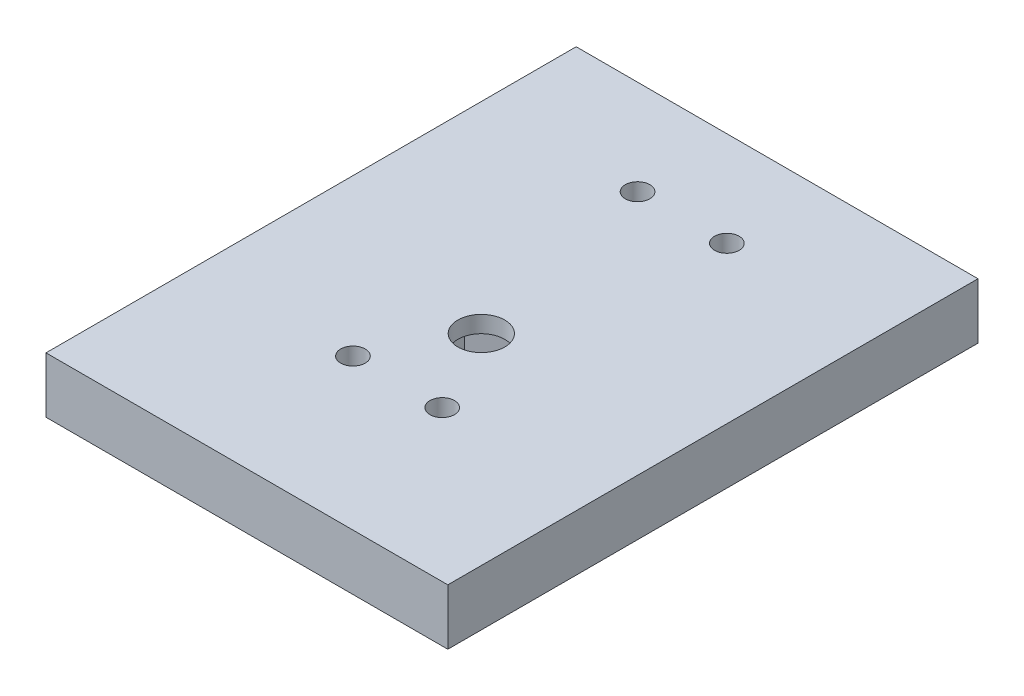
ISO-10303-21;
HEADER;
FILE_DESCRIPTION(('STEP AP214'),'2;1');
FILE_NAME('part.step','',(''),(''),'','','');
FILE_SCHEMA(('AUTOMOTIVE_DESIGN { 1 0 10303 214 1 1 1 1 }'));
ENDSEC;
DATA;
#1=APPLICATION_CONTEXT('core data for automotive mechanical design processes');
#2=APPLICATION_PROTOCOL_DEFINITION('international standard','automotive_design',2000,#1);
#3=PRODUCT_CONTEXT('',#1,'mechanical');
#4=PRODUCT('Part','Part','',(#3));
#5=PRODUCT_RELATED_PRODUCT_CATEGORY('part','',(#4));
#6=PRODUCT_DEFINITION_FORMATION('','',#4);
#7=PRODUCT_DEFINITION_CONTEXT('part definition',#1,'design');
#8=PRODUCT_DEFINITION('design','',#6,#7);
#9=PRODUCT_DEFINITION_SHAPE('','',#8);
#10=(LENGTH_UNIT() NAMED_UNIT(*) SI_UNIT(.MILLI.,.METRE.));
#11=(NAMED_UNIT(*) PLANE_ANGLE_UNIT() SI_UNIT($,.RADIAN.));
#12=(NAMED_UNIT(*) SI_UNIT($,.STERADIAN.) SOLID_ANGLE_UNIT());
#13=UNCERTAINTY_MEASURE_WITH_UNIT(LENGTH_MEASURE(1.E-05),#10,'distance_accuracy_value','');
#14=(GEOMETRIC_REPRESENTATION_CONTEXT(3) GLOBAL_UNCERTAINTY_ASSIGNED_CONTEXT((#13)) GLOBAL_UNIT_ASSIGNED_CONTEXT((#10,
#11,#12)) REPRESENTATION_CONTEXT('',''));
#15=CARTESIAN_POINT('',(0.,0.,0.));
#16=DIRECTION('',(0.,0.,1.));
#17=DIRECTION('',(1.,0.,0.));
#18=AXIS2_PLACEMENT_3D('',#15,#16,#17);
#19=CARTESIAN_POINT('',(0.,10.,0.));
#20=DIRECTION('',(0.,-1.,0.));
#21=DIRECTION('',(0.,0.,-1.));
#22=AXIS2_PLACEMENT_3D('',#19,#20,#21);
#23=PLANE('',#22);
#24=CARTESIAN_POINT('',(117.160731424353,10.,25.3275510204083));
#25=DIRECTION('',(0.,-1.,0.));
#26=DIRECTION('',(0.,0.,-1.));
#27=AXIS2_PLACEMENT_3D('',#24,#25,#26);
#28=CIRCLE('',#27,4.19999999999999);
#29=CARTESIAN_POINT('',(117.160731424353,10.,21.1275510204083));
#30=VERTEX_POINT('',#29);
#31=EDGE_CURVE('E37',#30,#30,#28,.T.);
#32=ORIENTED_EDGE('',*,*,#31,.T.);
#33=EDGE_LOOP('',(#32));
#34=FACE_BOUND('',#33,.T.);
#35=DIRECTION('',(0.,0.,-1.));
#36=VECTOR('',#35,1.);
#37=CARTESIAN_POINT('',(153.160731424353,10.,-27.6724489795918));
#38=LINE('',#37,#36);
#39=CARTESIAN_POINT('',(153.160731424353,10.,67.3275510204082));
#40=VERTEX_POINT('',#39);
#41=CARTESIAN_POINT('',(153.160731424353,10.,-27.6724489795918));
#42=VERTEX_POINT('',#41);
#43=EDGE_CURVE('E201',#40,#42,#38,.T.);
#44=ORIENTED_EDGE('',*,*,#43,.T.);
#45=DIRECTION('',(-1.,0.,0.));
#46=VECTOR('',#45,1.);
#47=CARTESIAN_POINT('',(153.160731424353,10.,-27.6724489795918));
#48=LINE('',#47,#46);
#49=CARTESIAN_POINT('',(81.1607314243527,10.,-27.6724489795918));
#50=VERTEX_POINT('',#49);
#51=EDGE_CURVE('E86',#42,#50,#48,.T.);
#52=ORIENTED_EDGE('',*,*,#51,.T.);
#53=DIRECTION('',(0.,0.,1.));
#54=VECTOR('',#53,1.);
#55=CARTESIAN_POINT('',(81.1607314243527,10.,-27.6724489795918));
#56=LINE('',#55,#54);
#57=CARTESIAN_POINT('',(81.1607314243527,10.,67.3275510204082));
#58=VERTEX_POINT('',#57);
#59=EDGE_CURVE('E204',#50,#58,#56,.T.);
#60=ORIENTED_EDGE('',*,*,#59,.T.);
#61=DIRECTION('',(1.,0.,0.));
#62=VECTOR('',#61,1.);
#63=CARTESIAN_POINT('',(153.160731424353,10.,67.3275510204082));
#64=LINE('',#63,#62);
#65=EDGE_CURVE('E58',#58,#40,#64,.T.);
#66=ORIENTED_EDGE('',*,*,#65,.T.);
#67=EDGE_LOOP('',(#44,#52,#60,#66));
#68=FACE_BOUND('',#67,.T.);
#69=CARTESIAN_POINT('',(125.160731424353,10.,-10.6724489795918));
#70=DIRECTION('',(0.,1.,0.));
#71=DIRECTION('',(0.,0.,1.));
#72=AXIS2_PLACEMENT_3D('',#69,#70,#71);
#73=CIRCLE('',#72,2.20000000000001);
#74=CARTESIAN_POINT('',(125.160731424353,10.,-8.47244897959182));
#75=VERTEX_POINT('',#74);
#76=EDGE_CURVE('E195',#75,#75,#73,.T.);
#77=ORIENTED_EDGE('',*,*,#76,.F.);
#78=EDGE_LOOP('',(#77));
#79=FACE_BOUND('',#78,.T.);
#80=CARTESIAN_POINT('',(109.160731424353,10.,-10.6724489795918));
#81=DIRECTION('',(0.,1.,0.));
#82=DIRECTION('',(0.,0.,1.));
#83=AXIS2_PLACEMENT_3D('',#80,#81,#82);
#84=CIRCLE('',#83,2.2);
#85=CARTESIAN_POINT('',(109.160731424353,10.,-8.47244897959183));
#86=VERTEX_POINT('',#85);
#87=EDGE_CURVE('E189',#86,#86,#84,.T.);
#88=ORIENTED_EDGE('',*,*,#87,.F.);
#89=EDGE_LOOP('',(#88));
#90=FACE_BOUND('',#89,.T.);
#91=CARTESIAN_POINT('',(125.160731424353,10.,40.3275510204082));
#92=DIRECTION('',(0.,1.,0.));
#93=DIRECTION('',(0.,0.,1.));
#94=AXIS2_PLACEMENT_3D('',#91,#92,#93);
#95=CIRCLE('',#94,2.1942799116235);
#96=CARTESIAN_POINT('',(125.160731424353,10.,42.5218309320317));
#97=VERTEX_POINT('',#96);
#98=EDGE_CURVE('E183',#97,#97,#95,.T.);
#99=ORIENTED_EDGE('',*,*,#98,.F.);
#100=EDGE_LOOP('',(#99));
#101=FACE_BOUND('',#100,.T.);
#102=CARTESIAN_POINT('',(109.160731424353,10.,40.3275510204082));
#103=DIRECTION('',(0.,1.,0.));
#104=DIRECTION('',(0.,0.,1.));
#105=AXIS2_PLACEMENT_3D('',#102,#103,#104);
#106=CIRCLE('',#105,2.20000000000001);
#107=CARTESIAN_POINT('',(109.160731424353,10.,42.5275510204082));
#108=VERTEX_POINT('',#107);
#109=EDGE_CURVE('E177',#108,#108,#106,.T.);
#110=ORIENTED_EDGE('',*,*,#109,.F.);
#111=EDGE_LOOP('',(#110));
#112=FACE_BOUND('',#111,.T.);
#113=ADVANCED_FACE('F33',(#34,#68,#79,#90,#101,#112),#23,.F.);
#114=CARTESIAN_POINT('',(0.,0.,0.));
#115=DIRECTION('',(0.,-1.,0.));
#116=DIRECTION('',(0.,0.,-1.));
#117=AXIS2_PLACEMENT_3D('',#114,#115,#116);
#118=PLANE('',#117);
#119=DIRECTION('',(-0.866025403784449,0.,0.499999999999981));
#120=VECTOR('',#119,1.);
#121=CARTESIAN_POINT('',(117.160731424353,0.,33.6413948967391));
#122=LINE('',#121,#120);
#123=CARTESIAN_POINT('',(124.360731424353,0.,29.4844729585738));
#124=VERTEX_POINT('',#123);
#125=CARTESIAN_POINT('',(117.160731424353,0.,33.6413948967391));
#126=VERTEX_POINT('',#125);
#127=EDGE_CURVE('E49',#124,#126,#122,.T.);
#128=ORIENTED_EDGE('',*,*,#127,.F.);
#129=DIRECTION('',(0.,0.,1.));
#130=VECTOR('',#129,1.);
#131=CARTESIAN_POINT('',(124.360731424353,0.,29.4844729585738));
#132=LINE('',#131,#130);
#133=CARTESIAN_POINT('',(124.360731424353,0.,21.1706290822428));
#134=VERTEX_POINT('',#133);
#135=EDGE_CURVE('E141',#134,#124,#132,.T.);
#136=ORIENTED_EDGE('',*,*,#135,.F.);
#137=DIRECTION('',(0.866025403784444,0.,0.499999999999991));
#138=VECTOR('',#137,1.);
#139=CARTESIAN_POINT('',(124.360731424353,0.,21.1706290822428));
#140=LINE('',#139,#138);
#141=CARTESIAN_POINT('',(117.160731424353,0.,17.0137071440775));
#142=VERTEX_POINT('',#141);
#143=EDGE_CURVE('E144',#142,#134,#140,.T.);
#144=ORIENTED_EDGE('',*,*,#143,.F.);
#145=DIRECTION('',(0.866025403784436,0.,-0.500000000000005));
#146=VECTOR('',#145,1.);
#147=CARTESIAN_POINT('',(117.160731424353,0.,17.0137071440775));
#148=LINE('',#147,#146);
#149=CARTESIAN_POINT('',(109.960731424353,0.,21.1706290822429));
#150=VERTEX_POINT('',#149);
#151=EDGE_CURVE('E162',#150,#142,#148,.T.);
#152=ORIENTED_EDGE('',*,*,#151,.F.);
#153=DIRECTION('',(0.,0.,-1.));
#154=VECTOR('',#153,1.);
#155=CARTESIAN_POINT('',(109.960731424353,0.,21.1706290822429));
#156=LINE('',#155,#154);
#157=CARTESIAN_POINT('',(109.960731424353,0.,29.4844729585738));
#158=VERTEX_POINT('',#157);
#159=EDGE_CURVE('E159',#158,#150,#156,.T.);
#160=ORIENTED_EDGE('',*,*,#159,.F.);
#161=DIRECTION('',(-0.866025403784439,0.,-0.5));
#162=VECTOR('',#161,1.);
#163=CARTESIAN_POINT('',(109.960731424353,0.,29.4844729585738));
#164=LINE('',#163,#162);
#165=EDGE_CURVE('E157',#126,#158,#164,.T.);
#166=ORIENTED_EDGE('',*,*,#165,.F.);
#167=EDGE_LOOP('',(#128,#136,#144,#152,#160,#166));
#168=FACE_BOUND('',#167,.T.);
#169=CARTESIAN_POINT('',(125.160731424353,0.,40.3275510204082));
#170=DIRECTION('',(0.,1.,0.));
#171=DIRECTION('',(0.,0.,1.));
#172=AXIS2_PLACEMENT_3D('',#169,#170,#171);
#173=CIRCLE('',#172,2.1942799116235);
#174=CARTESIAN_POINT('',(125.160731424353,0.,42.5218309320317));
#175=VERTEX_POINT('',#174);
#176=EDGE_CURVE('E180',#175,#175,#173,.T.);
#177=ORIENTED_EDGE('',*,*,#176,.T.);
#178=EDGE_LOOP('',(#177));
#179=FACE_BOUND('',#178,.T.);
#180=CARTESIAN_POINT('',(125.160731424353,0.,-10.6724489795918));
#181=DIRECTION('',(0.,1.,0.));
#182=DIRECTION('',(0.,0.,1.));
#183=AXIS2_PLACEMENT_3D('',#180,#181,#182);
#184=CIRCLE('',#183,2.20000000000001);
#185=CARTESIAN_POINT('',(125.160731424353,0.,-8.47244897959182));
#186=VERTEX_POINT('',#185);
#187=EDGE_CURVE('E192',#186,#186,#184,.T.);
#188=ORIENTED_EDGE('',*,*,#187,.T.);
#189=EDGE_LOOP('',(#188));
#190=FACE_BOUND('',#189,.T.);
#191=DIRECTION('',(0.,0.,-1.));
#192=VECTOR('',#191,1.);
#193=CARTESIAN_POINT('',(153.160731424353,0.,-27.6724489795918));
#194=LINE('',#193,#192);
#195=CARTESIAN_POINT('',(153.160731424353,0.,67.3275510204082));
#196=VERTEX_POINT('',#195);
#197=CARTESIAN_POINT('',(153.160731424353,0.,-27.6724489795918));
#198=VERTEX_POINT('',#197);
#199=EDGE_CURVE('E198',#196,#198,#194,.T.);
#200=ORIENTED_EDGE('',*,*,#199,.F.);
#201=DIRECTION('',(1.,0.,0.));
#202=VECTOR('',#201,1.);
#203=CARTESIAN_POINT('',(153.160731424353,0.,67.3275510204082));
#204=LINE('',#203,#202);
#205=CARTESIAN_POINT('',(81.1607314243527,0.,67.3275510204082));
#206=VERTEX_POINT('',#205);
#207=EDGE_CURVE('E79',#206,#196,#204,.T.);
#208=ORIENTED_EDGE('',*,*,#207,.F.);
#209=DIRECTION('',(0.,0.,1.));
#210=VECTOR('',#209,1.);
#211=CARTESIAN_POINT('',(81.1607314243527,0.,-27.6724489795918));
#212=LINE('',#211,#210);
#213=CARTESIAN_POINT('',(81.1607314243527,0.,-27.6724489795918));
#214=VERTEX_POINT('',#213);
#215=EDGE_CURVE('E212',#214,#206,#212,.T.);
#216=ORIENTED_EDGE('',*,*,#215,.F.);
#217=DIRECTION('',(-1.,0.,0.));
#218=VECTOR('',#217,1.);
#219=CARTESIAN_POINT('',(153.160731424353,0.,-27.6724489795918));
#220=LINE('',#219,#218);
#221=EDGE_CURVE('E210',#198,#214,#220,.T.);
#222=ORIENTED_EDGE('',*,*,#221,.F.);
#223=EDGE_LOOP('',(#200,#208,#216,#222));
#224=FACE_BOUND('',#223,.T.);
#225=CARTESIAN_POINT('',(109.160731424353,0.,-10.6724489795918));
#226=DIRECTION('',(0.,1.,0.));
#227=DIRECTION('',(0.,0.,1.));
#228=AXIS2_PLACEMENT_3D('',#225,#226,#227);
#229=CIRCLE('',#228,2.2);
#230=CARTESIAN_POINT('',(109.160731424353,0.,-8.47244897959183));
#231=VERTEX_POINT('',#230);
#232=EDGE_CURVE('E186',#231,#231,#229,.T.);
#233=ORIENTED_EDGE('',*,*,#232,.T.);
#234=EDGE_LOOP('',(#233));
#235=FACE_BOUND('',#234,.T.);
#236=CARTESIAN_POINT('',(109.160731424353,0.,40.3275510204082));
#237=DIRECTION('',(0.,1.,0.));
#238=DIRECTION('',(0.,0.,1.));
#239=AXIS2_PLACEMENT_3D('',#236,#237,#238);
#240=CIRCLE('',#239,2.20000000000001);
#241=CARTESIAN_POINT('',(109.160731424353,0.,42.5275510204082));
#242=VERTEX_POINT('',#241);
#243=EDGE_CURVE('E169',#242,#242,#240,.T.);
#244=ORIENTED_EDGE('',*,*,#243,.T.);
#245=EDGE_LOOP('',(#244));
#246=FACE_BOUND('',#245,.T.);
#247=ADVANCED_FACE('F226',(#168,#179,#190,#224,#235,#246),#118,.T.);
#248=CARTESIAN_POINT('',(153.160731424353,10.,-27.6724489795918));
#249=DIRECTION('',(-1.,0.,0.));
#250=DIRECTION('',(0.,0.,1.));
#251=AXIS2_PLACEMENT_3D('',#248,#249,#250);
#252=PLANE('',#251);
#253=ORIENTED_EDGE('',*,*,#199,.T.);
#254=DIRECTION('',(0.,-1.,0.));
#255=VECTOR('',#254,1.);
#256=CARTESIAN_POINT('',(153.160731424353,10.,-27.6724489795918));
#257=LINE('',#256,#255);
#258=EDGE_CURVE('E11',#42,#198,#257,.T.);
#259=ORIENTED_EDGE('',*,*,#258,.F.);
#260=ORIENTED_EDGE('',*,*,#43,.F.);
#261=DIRECTION('',(0.,-1.,0.));
#262=VECTOR('',#261,1.);
#263=CARTESIAN_POINT('',(153.160731424353,10.,67.3275510204082));
#264=LINE('',#263,#262);
#265=EDGE_CURVE('E207',#40,#196,#264,.T.);
#266=ORIENTED_EDGE('',*,*,#265,.T.);
#267=EDGE_LOOP('',(#253,#259,#260,#266));
#268=FACE_BOUND('',#267,.T.);
#269=ADVANCED_FACE('F35',(#268),#252,.F.);
#270=CARTESIAN_POINT('',(153.160731424353,10.,-27.6724489795918));
#271=DIRECTION('',(0.,0.,1.));
#272=DIRECTION('',(1.,0.,0.));
#273=AXIS2_PLACEMENT_3D('',#270,#271,#272);
#274=PLANE('',#273);
#275=ORIENTED_EDGE('',*,*,#221,.T.);
#276=DIRECTION('',(0.,-1.,0.));
#277=VECTOR('',#276,1.);
#278=CARTESIAN_POINT('',(81.1607314243527,10.,-27.6724489795918));
#279=LINE('',#278,#277);
#280=EDGE_CURVE('E42',#50,#214,#279,.T.);
#281=ORIENTED_EDGE('',*,*,#280,.F.);
#282=ORIENTED_EDGE('',*,*,#51,.F.);
#283=ORIENTED_EDGE('',*,*,#258,.T.);
#284=EDGE_LOOP('',(#275,#281,#282,#283));
#285=FACE_BOUND('',#284,.T.);
#286=ADVANCED_FACE('F242',(#285),#274,.F.);
#287=CARTESIAN_POINT('',(81.1607314243527,10.,-27.6724489795918));
#288=DIRECTION('',(1.,0.,0.));
#289=DIRECTION('',(0.,0.,-1.));
#290=AXIS2_PLACEMENT_3D('',#287,#288,#289);
#291=PLANE('',#290);
#292=ORIENTED_EDGE('',*,*,#215,.T.);
#293=DIRECTION('',(0.,-1.,0.));
#294=VECTOR('',#293,1.);
#295=CARTESIAN_POINT('',(81.1607314243527,10.,67.3275510204082));
#296=LINE('',#295,#294);
#297=EDGE_CURVE('E216',#58,#206,#296,.T.);
#298=ORIENTED_EDGE('',*,*,#297,.F.);
#299=ORIENTED_EDGE('',*,*,#59,.F.);
#300=ORIENTED_EDGE('',*,*,#280,.T.);
#301=EDGE_LOOP('',(#292,#298,#299,#300));
#302=FACE_BOUND('',#301,.T.);
#303=ADVANCED_FACE('F222',(#302),#291,.F.);
#304=CARTESIAN_POINT('',(153.160731424353,10.,67.3275510204082));
#305=DIRECTION('',(0.,0.,-1.));
#306=DIRECTION('',(-1.,0.,0.));
#307=AXIS2_PLACEMENT_3D('',#304,#305,#306);
#308=PLANE('',#307);
#309=ORIENTED_EDGE('',*,*,#207,.T.);
#310=ORIENTED_EDGE('',*,*,#265,.F.);
#311=ORIENTED_EDGE('',*,*,#65,.F.);
#312=ORIENTED_EDGE('',*,*,#297,.T.);
#313=EDGE_LOOP('',(#309,#310,#311,#312));
#314=FACE_BOUND('',#313,.T.);
#315=ADVANCED_FACE('F231',(#314),#308,.F.);
#316=CARTESIAN_POINT('',(125.160731424353,10.,-10.6724489795918));
#317=DIRECTION('',(0.,-1.,0.));
#318=DIRECTION('',(0.,0.,-1.));
#319=AXIS2_PLACEMENT_3D('',#316,#317,#318);
#320=CYLINDRICAL_SURFACE('',#319,2.20000000000001);
#321=ORIENTED_EDGE('',*,*,#76,.T.);
#322=EDGE_LOOP('',(#321));
#323=FACE_BOUND('',#322,.T.);
#324=ORIENTED_EDGE('',*,*,#187,.F.);
#325=EDGE_LOOP('',(#324));
#326=FACE_BOUND('',#325,.T.);
#327=ADVANCED_FACE('F233',(#323,#326),#320,.F.);
#328=CARTESIAN_POINT('',(109.160731424353,10.,-10.6724489795918));
#329=DIRECTION('',(0.,-1.,0.));
#330=DIRECTION('',(0.,0.,-1.));
#331=AXIS2_PLACEMENT_3D('',#328,#329,#330);
#332=CYLINDRICAL_SURFACE('',#331,2.2);
#333=ORIENTED_EDGE('',*,*,#87,.T.);
#334=EDGE_LOOP('',(#333));
#335=FACE_BOUND('',#334,.T.);
#336=ORIENTED_EDGE('',*,*,#232,.F.);
#337=EDGE_LOOP('',(#336));
#338=FACE_BOUND('',#337,.T.);
#339=ADVANCED_FACE('F239',(#335,#338),#332,.F.);
#340=CARTESIAN_POINT('',(125.160731424353,10.,40.3275510204082));
#341=DIRECTION('',(0.,-1.,0.));
#342=DIRECTION('',(0.,0.,-1.));
#343=AXIS2_PLACEMENT_3D('',#340,#341,#342);
#344=CYLINDRICAL_SURFACE('',#343,2.1942799116235);
#345=ORIENTED_EDGE('',*,*,#98,.T.);
#346=EDGE_LOOP('',(#345));
#347=FACE_BOUND('',#346,.T.);
#348=ORIENTED_EDGE('',*,*,#176,.F.);
#349=EDGE_LOOP('',(#348));
#350=FACE_BOUND('',#349,.T.);
#351=ADVANCED_FACE('F256',(#347,#350),#344,.F.);
#352=CARTESIAN_POINT('',(109.160731424353,10.,40.3275510204082));
#353=DIRECTION('',(0.,-1.,0.));
#354=DIRECTION('',(0.,0.,-1.));
#355=AXIS2_PLACEMENT_3D('',#352,#353,#354);
#356=CYLINDRICAL_SURFACE('',#355,2.20000000000001);
#357=ORIENTED_EDGE('',*,*,#109,.T.);
#358=EDGE_LOOP('',(#357));
#359=FACE_BOUND('',#358,.T.);
#360=ORIENTED_EDGE('',*,*,#243,.F.);
#361=EDGE_LOOP('',(#360));
#362=FACE_BOUND('',#361,.T.);
#363=ADVANCED_FACE('F260',(#359,#362),#356,.F.);
#364=CARTESIAN_POINT('',(117.160731424353,7.,33.6413948967391));
#365=DIRECTION('',(0.499999999999982,0.,0.866025403784449));
#366=DIRECTION('',(0.866025403784449,0.,-0.499999999999982));
#367=AXIS2_PLACEMENT_3D('',#364,#365,#366);
#368=PLANE('',#367);
#369=ORIENTED_EDGE('',*,*,#127,.T.);
#370=DIRECTION('',(0.,-1.,0.));
#371=VECTOR('',#370,1.);
#372=CARTESIAN_POINT('',(117.160731424353,7.,33.6413948967391));
#373=LINE('',#372,#371);
#374=CARTESIAN_POINT('',(117.160731424353,7.,33.6413948967391));
#375=VERTEX_POINT('',#374);
#376=EDGE_CURVE('E118',#375,#126,#373,.T.);
#377=ORIENTED_EDGE('',*,*,#376,.F.);
#378=DIRECTION('',(-0.866025403784449,0.,0.499999999999981));
#379=VECTOR('',#378,1.);
#380=CARTESIAN_POINT('',(117.160731424353,7.,33.6413948967391));
#381=LINE('',#380,#379);
#382=CARTESIAN_POINT('',(124.360731424353,7.,29.4844729585738));
#383=VERTEX_POINT('',#382);
#384=EDGE_CURVE('E122',#383,#375,#381,.T.);
#385=ORIENTED_EDGE('',*,*,#384,.F.);
#386=DIRECTION('',(0.,-1.,0.));
#387=VECTOR('',#386,1.);
#388=CARTESIAN_POINT('',(124.360731424353,7.,29.4844729585738));
#389=LINE('',#388,#387);
#390=EDGE_CURVE('E167',#383,#124,#389,.T.);
#391=ORIENTED_EDGE('',*,*,#390,.T.);
#392=EDGE_LOOP('',(#369,#377,#385,#391));
#393=FACE_BOUND('',#392,.T.);
#394=ADVANCED_FACE('F120',(#393),#368,.F.);
#395=CARTESIAN_POINT('',(124.360731424353,7.,29.4844729585738));
#396=DIRECTION('',(1.,0.,0.));
#397=DIRECTION('',(0.,0.,-1.));
#398=AXIS2_PLACEMENT_3D('',#395,#396,#397);
#399=PLANE('',#398);
#400=ORIENTED_EDGE('',*,*,#135,.T.);
#401=ORIENTED_EDGE('',*,*,#390,.F.);
#402=DIRECTION('',(0.,0.,1.));
#403=VECTOR('',#402,1.);
#404=CARTESIAN_POINT('',(124.360731424353,7.,29.4844729585738));
#405=LINE('',#404,#403);
#406=CARTESIAN_POINT('',(124.360731424353,7.,21.1706290822428));
#407=VERTEX_POINT('',#406);
#408=EDGE_CURVE('E128',#407,#383,#405,.T.);
#409=ORIENTED_EDGE('',*,*,#408,.F.);
#410=DIRECTION('',(0.,-1.,0.));
#411=VECTOR('',#410,1.);
#412=CARTESIAN_POINT('',(124.360731424353,7.,21.1706290822428));
#413=LINE('',#412,#411);
#414=EDGE_CURVE('E170',#407,#134,#413,.T.);
#415=ORIENTED_EDGE('',*,*,#414,.T.);
#416=EDGE_LOOP('',(#400,#401,#409,#415));
#417=FACE_BOUND('',#416,.T.);
#418=ADVANCED_FACE('F267',(#417),#399,.F.);
#419=CARTESIAN_POINT('',(124.360731424353,7.,21.1706290822428));
#420=DIRECTION('',(0.499999999999991,0.,-0.866025403784444));
#421=DIRECTION('',(-0.866025403784444,0.,-0.499999999999991));
#422=AXIS2_PLACEMENT_3D('',#419,#420,#421);
#423=PLANE('',#422);
#424=ORIENTED_EDGE('',*,*,#143,.T.);
#425=ORIENTED_EDGE('',*,*,#414,.F.);
#426=DIRECTION('',(0.866025403784444,0.,0.499999999999991));
#427=VECTOR('',#426,1.);
#428=CARTESIAN_POINT('',(124.360731424353,7.,21.1706290822428));
#429=LINE('',#428,#427);
#430=CARTESIAN_POINT('',(117.160731424353,7.,17.0137071440775));
#431=VERTEX_POINT('',#430);
#432=EDGE_CURVE('E153',#431,#407,#429,.T.);
#433=ORIENTED_EDGE('',*,*,#432,.F.);
#434=DIRECTION('',(0.,-1.,0.));
#435=VECTOR('',#434,1.);
#436=CARTESIAN_POINT('',(117.160731424353,7.,17.0137071440775));
#437=LINE('',#436,#435);
#438=EDGE_CURVE('E172',#431,#142,#437,.T.);
#439=ORIENTED_EDGE('',*,*,#438,.T.);
#440=EDGE_LOOP('',(#424,#425,#433,#439));
#441=FACE_BOUND('',#440,.T.);
#442=ADVANCED_FACE('F277',(#441),#423,.F.);
#443=CARTESIAN_POINT('',(117.160731424353,7.,17.0137071440775));
#444=DIRECTION('',(-0.500000000000005,0.,-0.866025403784436));
#445=DIRECTION('',(-0.866025403784436,0.,0.500000000000005));
#446=AXIS2_PLACEMENT_3D('',#443,#444,#445);
#447=PLANE('',#446);
#448=ORIENTED_EDGE('',*,*,#151,.T.);
#449=ORIENTED_EDGE('',*,*,#438,.F.);
#450=DIRECTION('',(0.866025403784436,0.,-0.500000000000005));
#451=VECTOR('',#450,1.);
#452=CARTESIAN_POINT('',(117.160731424353,7.,17.0137071440775));
#453=LINE('',#452,#451);
#454=CARTESIAN_POINT('',(109.960731424353,7.,21.1706290822429));
#455=VERTEX_POINT('',#454);
#456=EDGE_CURVE('E150',#455,#431,#453,.T.);
#457=ORIENTED_EDGE('',*,*,#456,.F.);
#458=DIRECTION('',(0.,-1.,0.));
#459=VECTOR('',#458,1.);
#460=CARTESIAN_POINT('',(109.960731424353,7.,21.1706290822429));
#461=LINE('',#460,#459);
#462=EDGE_CURVE('E174',#455,#150,#461,.T.);
#463=ORIENTED_EDGE('',*,*,#462,.T.);
#464=EDGE_LOOP('',(#448,#449,#457,#463));
#465=FACE_BOUND('',#464,.T.);
#466=ADVANCED_FACE('F273',(#465),#447,.F.);
#467=CARTESIAN_POINT('',(109.960731424353,7.,21.1706290822429));
#468=DIRECTION('',(-1.,0.,0.));
#469=DIRECTION('',(0.,0.,1.));
#470=AXIS2_PLACEMENT_3D('',#467,#468,#469);
#471=PLANE('',#470);
#472=ORIENTED_EDGE('',*,*,#159,.T.);
#473=ORIENTED_EDGE('',*,*,#462,.F.);
#474=DIRECTION('',(0.,0.,-1.));
#475=VECTOR('',#474,1.);
#476=CARTESIAN_POINT('',(109.960731424353,7.,21.1706290822429));
#477=LINE('',#476,#475);
#478=CARTESIAN_POINT('',(109.960731424353,7.,29.4844729585738));
#479=VERTEX_POINT('',#478);
#480=EDGE_CURVE('E136',#479,#455,#477,.T.);
#481=ORIENTED_EDGE('',*,*,#480,.F.);
#482=DIRECTION('',(0.,-1.,0.));
#483=VECTOR('',#482,1.);
#484=CARTESIAN_POINT('',(109.960731424353,7.,29.4844729585738));
#485=LINE('',#484,#483);
#486=EDGE_CURVE('E127',#479,#158,#485,.T.);
#487=ORIENTED_EDGE('',*,*,#486,.T.);
#488=EDGE_LOOP('',(#472,#473,#481,#487));
#489=FACE_BOUND('',#488,.T.);
#490=ADVANCED_FACE('F270',(#489),#471,.F.);
#491=CARTESIAN_POINT('',(109.960731424353,7.,29.4844729585738));
#492=DIRECTION('',(-0.5,0.,0.866025403784439));
#493=DIRECTION('',(0.866025403784439,0.,0.5));
#494=AXIS2_PLACEMENT_3D('',#491,#492,#493);
#495=PLANE('',#494);
#496=ORIENTED_EDGE('',*,*,#165,.T.);
#497=ORIENTED_EDGE('',*,*,#486,.F.);
#498=DIRECTION('',(-0.866025403784439,0.,-0.5));
#499=VECTOR('',#498,1.);
#500=CARTESIAN_POINT('',(109.960731424353,7.,29.4844729585738));
#501=LINE('',#500,#499);
#502=EDGE_CURVE('E131',#375,#479,#501,.T.);
#503=ORIENTED_EDGE('',*,*,#502,.F.);
#504=ORIENTED_EDGE('',*,*,#376,.T.);
#505=EDGE_LOOP('',(#496,#497,#503,#504));
#506=FACE_BOUND('',#505,.T.);
#507=ADVANCED_FACE('F132',(#506),#495,.F.);
#508=CARTESIAN_POINT('',(0.,7.,0.));
#509=DIRECTION('',(0.,1.,0.));
#510=DIRECTION('',(0.,0.,1.));
#511=AXIS2_PLACEMENT_3D('',#508,#509,#510);
#512=PLANE('',#511);
#513=CARTESIAN_POINT('',(117.160731424353,7.,25.3275510204083));
#514=DIRECTION('',(0.,-1.,0.));
#515=DIRECTION('',(0.,0.,-1.));
#516=AXIS2_PLACEMENT_3D('',#513,#514,#515);
#517=CIRCLE('',#516,4.19999999999999);
#518=CARTESIAN_POINT('',(117.160731424353,7.,21.1275510204083));
#519=VERTEX_POINT('',#518);
#520=EDGE_CURVE('E147',#519,#519,#517,.T.);
#521=ORIENTED_EDGE('',*,*,#520,.F.);
#522=EDGE_LOOP('',(#521));
#523=FACE_BOUND('',#522,.T.);
#524=ORIENTED_EDGE('',*,*,#384,.T.);
#525=ORIENTED_EDGE('',*,*,#502,.T.);
#526=ORIENTED_EDGE('',*,*,#480,.T.);
#527=ORIENTED_EDGE('',*,*,#456,.T.);
#528=ORIENTED_EDGE('',*,*,#432,.T.);
#529=ORIENTED_EDGE('',*,*,#408,.T.);
#530=EDGE_LOOP('',(#524,#525,#526,#527,#528,#529));
#531=FACE_BOUND('',#530,.T.);
#532=ADVANCED_FACE('F138',(#523,#531),#512,.F.);
#533=CARTESIAN_POINT('',(117.160731424353,14.,25.3275510204083));
#534=DIRECTION('',(0.,-1.,0.));
#535=DIRECTION('',(0.,0.,-1.));
#536=AXIS2_PLACEMENT_3D('',#533,#534,#535);
#537=CYLINDRICAL_SURFACE('',#536,4.19999999999999);
#538=ORIENTED_EDGE('',*,*,#520,.T.);
#539=EDGE_LOOP('',(#538));
#540=FACE_BOUND('',#539,.T.);
#541=ORIENTED_EDGE('',*,*,#31,.F.);
#542=EDGE_LOOP('',(#541));
#543=FACE_BOUND('',#542,.T.);
#544=ADVANCED_FACE('F287',(#540,#543),#537,.F.);
#545=CLOSED_SHELL('',(#113,#247,#269,#286,#303,#315,#327,#339,#351,#363,#394,#418,#442,#466,
#490,#507,#532,#544));
#546=MANIFOLD_SOLID_BREP('B2',#545);
#547=ADVANCED_BREP_SHAPE_REPRESENTATION('',(#18,#546),#14);
#548=SHAPE_DEFINITION_REPRESENTATION(#9,#547);
ENDSEC;
END-ISO-10303-21;
